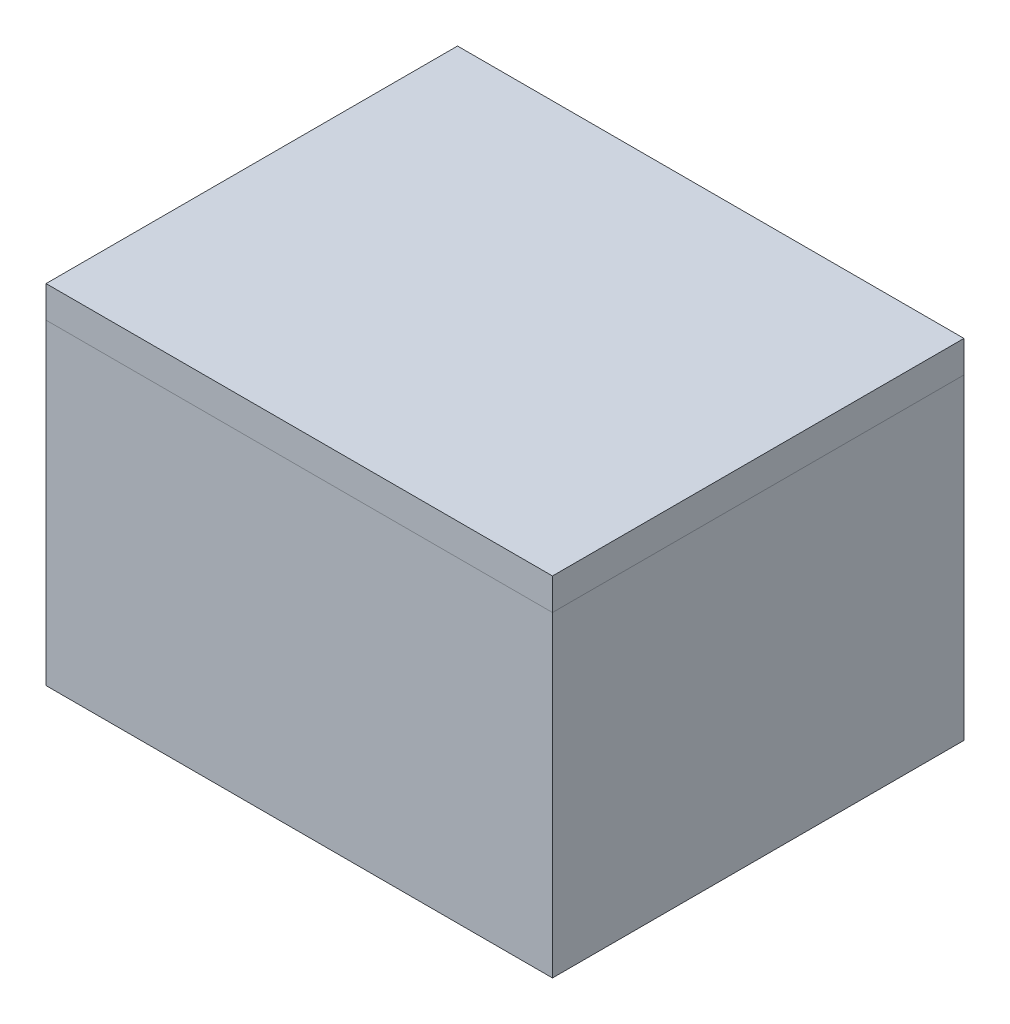
ISO-10303-21;
HEADER;
FILE_DESCRIPTION(('STEP AP214'),'2;1');
FILE_NAME('part.step','',(''),(''),'','','');
FILE_SCHEMA(('AUTOMOTIVE_DESIGN { 1 0 10303 214 1 1 1 1 }'));
ENDSEC;
DATA;
#1=APPLICATION_CONTEXT('core data for automotive mechanical design processes');
#2=APPLICATION_PROTOCOL_DEFINITION('international standard','automotive_design',2000,#1);
#3=PRODUCT_CONTEXT('',#1,'mechanical');
#4=PRODUCT('Part','Part','',(#3));
#5=PRODUCT_RELATED_PRODUCT_CATEGORY('part','',(#4));
#6=PRODUCT_DEFINITION_FORMATION('','',#4);
#7=PRODUCT_DEFINITION_CONTEXT('part definition',#1,'design');
#8=PRODUCT_DEFINITION('design','',#6,#7);
#9=PRODUCT_DEFINITION_SHAPE('','',#8);
#10=(LENGTH_UNIT() NAMED_UNIT(*) SI_UNIT(.MILLI.,.METRE.));
#11=(NAMED_UNIT(*) PLANE_ANGLE_UNIT() SI_UNIT($,.RADIAN.));
#12=(NAMED_UNIT(*) SI_UNIT($,.STERADIAN.) SOLID_ANGLE_UNIT());
#13=UNCERTAINTY_MEASURE_WITH_UNIT(LENGTH_MEASURE(1.E-05),#10,'distance_accuracy_value','');
#14=(GEOMETRIC_REPRESENTATION_CONTEXT(3) GLOBAL_UNCERTAINTY_ASSIGNED_CONTEXT((#13)) GLOBAL_UNIT_ASSIGNED_CONTEXT((#10,
#11,#12)) REPRESENTATION_CONTEXT('',''));
#15=CARTESIAN_POINT('',(0.,0.,0.));
#16=DIRECTION('',(0.,0.,1.));
#17=DIRECTION('',(1.,0.,0.));
#18=AXIS2_PLACEMENT_3D('',#15,#16,#17);
#19=CARTESIAN_POINT('',(0.,-127.,-82.55));
#20=DIRECTION('',(0.,0.,1.));
#21=DIRECTION('',(1.,0.,0.));
#22=AXIS2_PLACEMENT_3D('',#19,#20,#21);
#23=PLANE('',#22);
#24=DIRECTION('',(1.,0.,0.));
#25=VECTOR('',#24,1.);
#26=CARTESIAN_POINT('',(0.,0.,-82.55));
#27=LINE('',#26,#25);
#28=CARTESIAN_POINT('',(-101.6,0.,-82.55));
#29=VERTEX_POINT('',#28);
#30=CARTESIAN_POINT('',(101.6,0.,-82.55));
#31=VERTEX_POINT('',#30);
#32=EDGE_CURVE('E181',#29,#31,#27,.T.);
#33=ORIENTED_EDGE('',*,*,#32,.T.);
#34=DIRECTION('',(0.,1.,0.));
#35=VECTOR('',#34,1.);
#36=CARTESIAN_POINT('',(101.6,-127.,-82.55));
#37=LINE('',#36,#35);
#38=CARTESIAN_POINT('',(101.6,-127.,-82.55));
#39=VERTEX_POINT('',#38);
#40=EDGE_CURVE('E12',#39,#31,#37,.T.);
#41=ORIENTED_EDGE('',*,*,#40,.F.);
#42=DIRECTION('',(1.,0.,0.));
#43=VECTOR('',#42,1.);
#44=CARTESIAN_POINT('',(0.,-127.,-82.55));
#45=LINE('',#44,#43);
#46=CARTESIAN_POINT('',(-101.6,-127.,-82.55));
#47=VERTEX_POINT('',#46);
#48=EDGE_CURVE('E147',#47,#39,#45,.T.);
#49=ORIENTED_EDGE('',*,*,#48,.F.);
#50=DIRECTION('',(0.,1.,0.));
#51=VECTOR('',#50,1.);
#52=CARTESIAN_POINT('',(-101.6,-127.,-82.55));
#53=LINE('',#52,#51);
#54=EDGE_CURVE('E192',#47,#29,#53,.T.);
#55=ORIENTED_EDGE('',*,*,#54,.T.);
#56=EDGE_LOOP('',(#33,#41,#49,#55));
#57=FACE_BOUND('',#56,.T.);
#58=ADVANCED_FACE('F55',(#57),#23,.F.);
#59=CARTESIAN_POINT('',(101.6,-127.,0.));
#60=DIRECTION('',(-1.,0.,0.));
#61=DIRECTION('',(0.,0.,1.));
#62=AXIS2_PLACEMENT_3D('',#59,#60,#61);
#63=PLANE('',#62);
#64=DIRECTION('',(0.,0.,1.));
#65=VECTOR('',#64,1.);
#66=CARTESIAN_POINT('',(101.6,0.,0.));
#67=LINE('',#66,#65);
#68=CARTESIAN_POINT('',(101.6,0.,82.55));
#69=VERTEX_POINT('',#68);
#70=EDGE_CURVE('E153',#31,#69,#67,.T.);
#71=ORIENTED_EDGE('',*,*,#70,.T.);
#72=DIRECTION('',(0.,1.,0.));
#73=VECTOR('',#72,1.);
#74=CARTESIAN_POINT('',(101.6,-127.,82.55));
#75=LINE('',#74,#73);
#76=CARTESIAN_POINT('',(101.6,-127.,82.55));
#77=VERTEX_POINT('',#76);
#78=EDGE_CURVE('E66',#77,#69,#75,.T.);
#79=ORIENTED_EDGE('',*,*,#78,.F.);
#80=DIRECTION('',(0.,0.,1.));
#81=VECTOR('',#80,1.);
#82=CARTESIAN_POINT('',(101.6,-127.,0.));
#83=LINE('',#82,#81);
#84=EDGE_CURVE('E141',#39,#77,#83,.T.);
#85=ORIENTED_EDGE('',*,*,#84,.F.);
#86=ORIENTED_EDGE('',*,*,#40,.T.);
#87=EDGE_LOOP('',(#71,#79,#85,#86));
#88=FACE_BOUND('',#87,.T.);
#89=ADVANCED_FACE('F152',(#88),#63,.F.);
#90=CARTESIAN_POINT('',(0.,-127.,82.55));
#91=DIRECTION('',(0.,0.,-1.));
#92=DIRECTION('',(-1.,0.,0.));
#93=AXIS2_PLACEMENT_3D('',#90,#91,#92);
#94=PLANE('',#93);
#95=DIRECTION('',(-1.,0.,0.));
#96=VECTOR('',#95,1.);
#97=CARTESIAN_POINT('',(0.,0.,82.55));
#98=LINE('',#97,#96);
#99=CARTESIAN_POINT('',(-101.6,0.,82.55));
#100=VERTEX_POINT('',#99);
#101=EDGE_CURVE('E110',#69,#100,#98,.T.);
#102=ORIENTED_EDGE('',*,*,#101,.T.);
#103=DIRECTION('',(0.,1.,0.));
#104=VECTOR('',#103,1.);
#105=CARTESIAN_POINT('',(-101.6,-127.,82.55));
#106=LINE('',#105,#104);
#107=CARTESIAN_POINT('',(-101.6,-127.,82.55));
#108=VERTEX_POINT('',#107);
#109=EDGE_CURVE('E154',#108,#100,#106,.T.);
#110=ORIENTED_EDGE('',*,*,#109,.F.);
#111=DIRECTION('',(-1.,0.,0.));
#112=VECTOR('',#111,1.);
#113=CARTESIAN_POINT('',(0.,-127.,82.55));
#114=LINE('',#113,#112);
#115=EDGE_CURVE('E145',#77,#108,#114,.T.);
#116=ORIENTED_EDGE('',*,*,#115,.F.);
#117=ORIENTED_EDGE('',*,*,#78,.T.);
#118=EDGE_LOOP('',(#102,#110,#116,#117));
#119=FACE_BOUND('',#118,.T.);
#120=ADVANCED_FACE('F156',(#119),#94,.F.);
#121=CARTESIAN_POINT('',(0.,-127.,-69.85));
#122=DIRECTION('',(0.,0.,1.));
#123=DIRECTION('',(1.,0.,0.));
#124=AXIS2_PLACEMENT_3D('',#121,#122,#123);
#125=PLANE('',#124);
#126=DIRECTION('',(1.,0.,0.));
#127=VECTOR('',#126,1.);
#128=CARTESIAN_POINT('',(0.,0.,-69.85));
#129=LINE('',#128,#127);
#130=CARTESIAN_POINT('',(-88.9,0.,-69.85));
#131=VERTEX_POINT('',#130);
#132=CARTESIAN_POINT('',(88.9,0.,-69.85));
#133=VERTEX_POINT('',#132);
#134=EDGE_CURVE('E165',#131,#133,#129,.T.);
#135=ORIENTED_EDGE('',*,*,#134,.F.);
#136=DIRECTION('',(0.,1.,0.));
#137=VECTOR('',#136,1.);
#138=CARTESIAN_POINT('',(-88.9,-127.,-69.85));
#139=LINE('',#138,#137);
#140=CARTESIAN_POINT('',(-88.9,-127.,-69.85));
#141=VERTEX_POINT('',#140);
#142=EDGE_CURVE('E59',#141,#131,#139,.T.);
#143=ORIENTED_EDGE('',*,*,#142,.F.);
#144=DIRECTION('',(1.,0.,0.));
#145=VECTOR('',#144,1.);
#146=CARTESIAN_POINT('',(0.,-127.,-69.85));
#147=LINE('',#146,#145);
#148=CARTESIAN_POINT('',(88.9,-127.,-69.85));
#149=VERTEX_POINT('',#148);
#150=EDGE_CURVE('E191',#141,#149,#147,.T.);
#151=ORIENTED_EDGE('',*,*,#150,.T.);
#152=DIRECTION('',(0.,1.,0.));
#153=VECTOR('',#152,1.);
#154=CARTESIAN_POINT('',(88.9,-127.,-69.85));
#155=LINE('',#154,#153);
#156=EDGE_CURVE('E161',#149,#133,#155,.T.);
#157=ORIENTED_EDGE('',*,*,#156,.T.);
#158=EDGE_LOOP('',(#135,#143,#151,#157));
#159=FACE_BOUND('',#158,.T.);
#160=ADVANCED_FACE('F57',(#159),#125,.T.);
#161=CARTESIAN_POINT('',(-88.9,-127.,0.));
#162=DIRECTION('',(1.,0.,0.));
#163=DIRECTION('',(0.,0.,-1.));
#164=AXIS2_PLACEMENT_3D('',#161,#162,#163);
#165=PLANE('',#164);
#166=DIRECTION('',(0.,0.,-1.));
#167=VECTOR('',#166,1.);
#168=CARTESIAN_POINT('',(-88.9,0.,0.));
#169=LINE('',#168,#167);
#170=CARTESIAN_POINT('',(-88.9,0.,69.85));
#171=VERTEX_POINT('',#170);
#172=EDGE_CURVE('E169',#171,#131,#169,.T.);
#173=ORIENTED_EDGE('',*,*,#172,.F.);
#174=DIRECTION('',(0.,1.,0.));
#175=VECTOR('',#174,1.);
#176=CARTESIAN_POINT('',(-88.9,-127.,69.85));
#177=LINE('',#176,#175);
#178=CARTESIAN_POINT('',(-88.9,-127.,69.85));
#179=VERTEX_POINT('',#178);
#180=EDGE_CURVE('E200',#179,#171,#177,.T.);
#181=ORIENTED_EDGE('',*,*,#180,.F.);
#182=DIRECTION('',(0.,0.,-1.));
#183=VECTOR('',#182,1.);
#184=CARTESIAN_POINT('',(-88.9,-127.,0.));
#185=LINE('',#184,#183);
#186=EDGE_CURVE('E212',#179,#141,#185,.T.);
#187=ORIENTED_EDGE('',*,*,#186,.T.);
#188=ORIENTED_EDGE('',*,*,#142,.T.);
#189=EDGE_LOOP('',(#173,#181,#187,#188));
#190=FACE_BOUND('',#189,.T.);
#191=ADVANCED_FACE('F210',(#190),#165,.T.);
#192=CARTESIAN_POINT('',(0.,-127.,69.85));
#193=DIRECTION('',(0.,0.,-1.));
#194=DIRECTION('',(-1.,0.,0.));
#195=AXIS2_PLACEMENT_3D('',#192,#193,#194);
#196=PLANE('',#195);
#197=DIRECTION('',(-1.,0.,0.));
#198=VECTOR('',#197,1.);
#199=CARTESIAN_POINT('',(0.,0.,69.85));
#200=LINE('',#199,#198);
#201=CARTESIAN_POINT('',(88.9,0.,69.85));
#202=VERTEX_POINT('',#201);
#203=EDGE_CURVE('E173',#202,#171,#200,.T.);
#204=ORIENTED_EDGE('',*,*,#203,.F.);
#205=DIRECTION('',(0.,1.,0.));
#206=VECTOR('',#205,1.);
#207=CARTESIAN_POINT('',(88.9,-127.,69.85));
#208=LINE('',#207,#206);
#209=CARTESIAN_POINT('',(88.9,-127.,69.85));
#210=VERTEX_POINT('',#209);
#211=EDGE_CURVE('E199',#210,#202,#208,.T.);
#212=ORIENTED_EDGE('',*,*,#211,.F.);
#213=DIRECTION('',(-1.,0.,0.));
#214=VECTOR('',#213,1.);
#215=CARTESIAN_POINT('',(0.,-127.,69.85));
#216=LINE('',#215,#214);
#217=EDGE_CURVE('E219',#210,#179,#216,.T.);
#218=ORIENTED_EDGE('',*,*,#217,.T.);
#219=ORIENTED_EDGE('',*,*,#180,.T.);
#220=EDGE_LOOP('',(#204,#212,#218,#219));
#221=FACE_BOUND('',#220,.T.);
#222=ADVANCED_FACE('F217',(#221),#196,.T.);
#223=CARTESIAN_POINT('',(88.9,-127.,0.));
#224=DIRECTION('',(-1.,0.,0.));
#225=DIRECTION('',(0.,0.,1.));
#226=AXIS2_PLACEMENT_3D('',#223,#224,#225);
#227=PLANE('',#226);
#228=DIRECTION('',(0.,0.,1.));
#229=VECTOR('',#228,1.);
#230=CARTESIAN_POINT('',(88.9,0.,0.));
#231=LINE('',#230,#229);
#232=EDGE_CURVE('E177',#133,#202,#231,.T.);
#233=ORIENTED_EDGE('',*,*,#232,.F.);
#234=ORIENTED_EDGE('',*,*,#156,.F.);
#235=DIRECTION('',(0.,0.,1.));
#236=VECTOR('',#235,1.);
#237=CARTESIAN_POINT('',(88.9,-127.,0.));
#238=LINE('',#237,#236);
#239=EDGE_CURVE('E224',#149,#210,#238,.T.);
#240=ORIENTED_EDGE('',*,*,#239,.T.);
#241=ORIENTED_EDGE('',*,*,#211,.T.);
#242=EDGE_LOOP('',(#233,#234,#240,#241));
#243=FACE_BOUND('',#242,.T.);
#244=ADVANCED_FACE('F226',(#243),#227,.T.);
#245=CARTESIAN_POINT('',(-101.6,-127.,0.));
#246=DIRECTION('',(1.,0.,0.));
#247=DIRECTION('',(0.,0.,-1.));
#248=AXIS2_PLACEMENT_3D('',#245,#246,#247);
#249=PLANE('',#248);
#250=DIRECTION('',(0.,0.,-1.));
#251=VECTOR('',#250,1.);
#252=CARTESIAN_POINT('',(-101.6,0.,0.));
#253=LINE('',#252,#251);
#254=EDGE_CURVE('E117',#100,#29,#253,.T.);
#255=ORIENTED_EDGE('',*,*,#254,.T.);
#256=ORIENTED_EDGE('',*,*,#54,.F.);
#257=DIRECTION('',(0.,0.,-1.));
#258=VECTOR('',#257,1.);
#259=CARTESIAN_POINT('',(-101.6,-127.,0.));
#260=LINE('',#259,#258);
#261=EDGE_CURVE('E75',#108,#47,#260,.T.);
#262=ORIENTED_EDGE('',*,*,#261,.F.);
#263=ORIENTED_EDGE('',*,*,#109,.T.);
#264=EDGE_LOOP('',(#255,#256,#262,#263));
#265=FACE_BOUND('',#264,.T.);
#266=ADVANCED_FACE('F234',(#265),#249,.F.);
#267=CARTESIAN_POINT('',(0.,-127.,0.));
#268=DIRECTION('',(0.,-1.,0.));
#269=DIRECTION('',(0.,0.,-1.));
#270=AXIS2_PLACEMENT_3D('',#267,#268,#269);
#271=PLANE('',#270);
#272=ORIENTED_EDGE('',*,*,#150,.F.);
#273=ORIENTED_EDGE('',*,*,#186,.F.);
#274=ORIENTED_EDGE('',*,*,#217,.F.);
#275=ORIENTED_EDGE('',*,*,#239,.F.);
#276=EDGE_LOOP('',(#272,#273,#274,#275));
#277=FACE_BOUND('',#276,.T.);
#278=ORIENTED_EDGE('',*,*,#48,.T.);
#279=ORIENTED_EDGE('',*,*,#84,.T.);
#280=ORIENTED_EDGE('',*,*,#115,.T.);
#281=ORIENTED_EDGE('',*,*,#261,.T.);
#282=EDGE_LOOP('',(#278,#279,#280,#281));
#283=FACE_BOUND('',#282,.T.);
#284=ADVANCED_FACE('F143',(#277,#283),#271,.T.);
#285=CARTESIAN_POINT('',(0.,0.,0.));
#286=DIRECTION('',(0.,-1.,0.));
#287=DIRECTION('',(0.,0.,-1.));
#288=AXIS2_PLACEMENT_3D('',#285,#286,#287);
#289=PLANE('',#288);
#290=ORIENTED_EDGE('',*,*,#134,.T.);
#291=ORIENTED_EDGE('',*,*,#232,.T.);
#292=ORIENTED_EDGE('',*,*,#203,.T.);
#293=ORIENTED_EDGE('',*,*,#172,.T.);
#294=EDGE_LOOP('',(#290,#291,#292,#293));
#295=FACE_BOUND('',#294,.T.);
#296=ORIENTED_EDGE('',*,*,#32,.F.);
#297=ORIENTED_EDGE('',*,*,#254,.F.);
#298=ORIENTED_EDGE('',*,*,#101,.F.);
#299=ORIENTED_EDGE('',*,*,#70,.F.);
#300=EDGE_LOOP('',(#296,#297,#298,#299));
#301=FACE_BOUND('',#300,.T.);
#302=ADVANCED_FACE('F215',(#295,#301),#289,.F.);
#303=CLOSED_SHELL('',(#58,#89,#120,#160,#191,#222,#244,#266,#284,#302));
#304=MANIFOLD_SOLID_BREP('B2',#303);
#305=CARTESIAN_POINT('',(101.6,12.7,82.55));
#306=DIRECTION('',(-1.,0.,0.));
#307=DIRECTION('',(0.,0.,1.));
#308=AXIS2_PLACEMENT_3D('',#305,#306,#307);
#309=PLANE('',#308);
#310=DIRECTION('',(0.,0.,-1.));
#311=VECTOR('',#310,1.);
#312=CARTESIAN_POINT('',(101.6,0.,82.55));
#313=LINE('',#312,#311);
#314=CARTESIAN_POINT('',(101.6,0.,82.55));
#315=VERTEX_POINT('',#314);
#316=CARTESIAN_POINT('',(101.6,0.,-82.55));
#317=VERTEX_POINT('',#316);
#318=EDGE_CURVE('E422',#315,#317,#313,.T.);
#319=ORIENTED_EDGE('',*,*,#318,.T.);
#320=DIRECTION('',(0.,-1.,0.));
#321=VECTOR('',#320,1.);
#322=CARTESIAN_POINT('',(101.6,12.7,-82.55));
#323=LINE('',#322,#321);
#324=CARTESIAN_POINT('',(101.6,12.7,-82.55));
#325=VERTEX_POINT('',#324);
#326=EDGE_CURVE('E53',#325,#317,#323,.T.);
#327=ORIENTED_EDGE('',*,*,#326,.F.);
#328=DIRECTION('',(0.,0.,-1.));
#329=VECTOR('',#328,1.);
#330=CARTESIAN_POINT('',(101.6,12.7,82.55));
#331=LINE('',#330,#329);
#332=CARTESIAN_POINT('',(101.6,12.7,82.55));
#333=VERTEX_POINT('',#332);
#334=EDGE_CURVE('E405',#333,#325,#331,.T.);
#335=ORIENTED_EDGE('',*,*,#334,.F.);
#336=DIRECTION('',(0.,-1.,0.));
#337=VECTOR('',#336,1.);
#338=CARTESIAN_POINT('',(101.6,12.7,82.55));
#339=LINE('',#338,#337);
#340=EDGE_CURVE('E418',#333,#315,#339,.T.);
#341=ORIENTED_EDGE('',*,*,#340,.T.);
#342=EDGE_LOOP('',(#319,#327,#335,#341));
#343=FACE_BOUND('',#342,.T.);
#344=ADVANCED_FACE('F347',(#343),#309,.F.);
#345=CARTESIAN_POINT('',(-101.6,12.7,-82.55));
#346=DIRECTION('',(0.,0.,1.));
#347=DIRECTION('',(1.,0.,0.));
#348=AXIS2_PLACEMENT_3D('',#345,#346,#347);
#349=PLANE('',#348);
#350=DIRECTION('',(-1.,0.,0.));
#351=VECTOR('',#350,1.);
#352=CARTESIAN_POINT('',(-101.6,0.,-82.55));
#353=LINE('',#352,#351);
#354=CARTESIAN_POINT('',(-101.6,0.,-82.55));
#355=VERTEX_POINT('',#354);
#356=EDGE_CURVE('E410',#317,#355,#353,.T.);
#357=ORIENTED_EDGE('',*,*,#356,.T.);
#358=DIRECTION('',(0.,-1.,0.));
#359=VECTOR('',#358,1.);
#360=CARTESIAN_POINT('',(-101.6,12.7,-82.55));
#361=LINE('',#360,#359);
#362=CARTESIAN_POINT('',(-101.6,12.7,-82.55));
#363=VERTEX_POINT('',#362);
#364=EDGE_CURVE('E356',#363,#355,#361,.T.);
#365=ORIENTED_EDGE('',*,*,#364,.F.);
#366=DIRECTION('',(-1.,0.,0.));
#367=VECTOR('',#366,1.);
#368=CARTESIAN_POINT('',(-101.6,12.7,-82.55));
#369=LINE('',#368,#367);
#370=EDGE_CURVE('E400',#325,#363,#369,.T.);
#371=ORIENTED_EDGE('',*,*,#370,.F.);
#372=ORIENTED_EDGE('',*,*,#326,.T.);
#373=EDGE_LOOP('',(#357,#365,#371,#372));
#374=FACE_BOUND('',#373,.T.);
#375=ADVANCED_FACE('F409',(#374),#349,.F.);
#376=CARTESIAN_POINT('',(-101.6,12.7,82.55));
#377=DIRECTION('',(1.,0.,0.));
#378=DIRECTION('',(0.,0.,-1.));
#379=AXIS2_PLACEMENT_3D('',#376,#377,#378);
#380=PLANE('',#379);
#381=DIRECTION('',(0.,0.,1.));
#382=VECTOR('',#381,1.);
#383=CARTESIAN_POINT('',(-101.6,0.,82.55));
#384=LINE('',#383,#382);
#385=CARTESIAN_POINT('',(-101.6,0.,82.55));
#386=VERTEX_POINT('',#385);
#387=EDGE_CURVE('E385',#355,#386,#384,.T.);
#388=ORIENTED_EDGE('',*,*,#387,.T.);
#389=DIRECTION('',(0.,-1.,0.));
#390=VECTOR('',#389,1.);
#391=CARTESIAN_POINT('',(-101.6,12.7,82.55));
#392=LINE('',#391,#390);
#393=CARTESIAN_POINT('',(-101.6,12.7,82.55));
#394=VERTEX_POINT('',#393);
#395=EDGE_CURVE('E412',#394,#386,#392,.T.);
#396=ORIENTED_EDGE('',*,*,#395,.F.);
#397=DIRECTION('',(0.,0.,1.));
#398=VECTOR('',#397,1.);
#399=CARTESIAN_POINT('',(-101.6,12.7,82.55));
#400=LINE('',#399,#398);
#401=EDGE_CURVE('E403',#363,#394,#400,.T.);
#402=ORIENTED_EDGE('',*,*,#401,.F.);
#403=ORIENTED_EDGE('',*,*,#364,.T.);
#404=EDGE_LOOP('',(#388,#396,#402,#403));
#405=FACE_BOUND('',#404,.T.);
#406=ADVANCED_FACE('F413',(#405),#380,.F.);
#407=CARTESIAN_POINT('',(-101.6,12.7,82.55));
#408=DIRECTION('',(0.,0.,-1.));
#409=DIRECTION('',(-1.,0.,0.));
#410=AXIS2_PLACEMENT_3D('',#407,#408,#409);
#411=PLANE('',#410);
#412=DIRECTION('',(1.,0.,0.));
#413=VECTOR('',#412,1.);
#414=CARTESIAN_POINT('',(-101.6,0.,82.55));
#415=LINE('',#414,#413);
#416=EDGE_CURVE('E391',#386,#315,#415,.T.);
#417=ORIENTED_EDGE('',*,*,#416,.T.);
#418=ORIENTED_EDGE('',*,*,#340,.F.);
#419=DIRECTION('',(1.,0.,0.));
#420=VECTOR('',#419,1.);
#421=CARTESIAN_POINT('',(-101.6,12.7,82.55));
#422=LINE('',#421,#420);
#423=EDGE_CURVE('E364',#394,#333,#422,.T.);
#424=ORIENTED_EDGE('',*,*,#423,.F.);
#425=ORIENTED_EDGE('',*,*,#395,.T.);
#426=EDGE_LOOP('',(#417,#418,#424,#425));
#427=FACE_BOUND('',#426,.T.);
#428=ADVANCED_FACE('F433',(#427),#411,.F.);
#429=CARTESIAN_POINT('',(0.,12.7,0.));
#430=DIRECTION('',(0.,-1.,0.));
#431=DIRECTION('',(0.,0.,-1.));
#432=AXIS2_PLACEMENT_3D('',#429,#430,#431);
#433=PLANE('',#432);
#434=ORIENTED_EDGE('',*,*,#334,.T.);
#435=ORIENTED_EDGE('',*,*,#370,.T.);
#436=ORIENTED_EDGE('',*,*,#401,.T.);
#437=ORIENTED_EDGE('',*,*,#423,.T.);
#438=EDGE_LOOP('',(#434,#435,#436,#437));
#439=FACE_BOUND('',#438,.T.);
#440=ADVANCED_FACE('F401',(#439),#433,.F.);
#441=CARTESIAN_POINT('',(0.,0.,0.));
#442=DIRECTION('',(0.,-1.,0.));
#443=DIRECTION('',(0.,0.,-1.));
#444=AXIS2_PLACEMENT_3D('',#441,#442,#443);
#445=PLANE('',#444);
#446=ORIENTED_EDGE('',*,*,#318,.F.);
#447=ORIENTED_EDGE('',*,*,#416,.F.);
#448=ORIENTED_EDGE('',*,*,#387,.F.);
#449=ORIENTED_EDGE('',*,*,#356,.F.);
#450=EDGE_LOOP('',(#446,#447,#448,#449));
#451=FACE_BOUND('',#450,.T.);
#452=ADVANCED_FACE('F436',(#451),#445,.T.);
#453=CLOSED_SHELL('',(#344,#375,#406,#428,#440,#452));
#454=MANIFOLD_SOLID_BREP('B6',#453);
#455=ADVANCED_BREP_SHAPE_REPRESENTATION('',(#18,#304,#454),#14);
#456=SHAPE_DEFINITION_REPRESENTATION(#9,#455);
ENDSEC;
END-ISO-10303-21;
